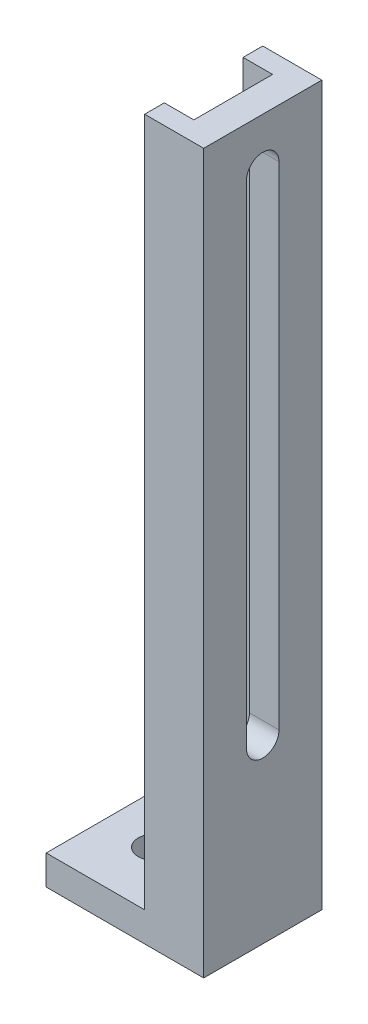
ISO-10303-21;
HEADER;
FILE_DESCRIPTION(('STEP AP214'),'2;1');
FILE_NAME('part.step','',(''),(''),'','','');
FILE_SCHEMA(('AUTOMOTIVE_DESIGN { 1 0 10303 214 1 1 1 1 }'));
ENDSEC;
DATA;
#1=APPLICATION_CONTEXT('core data for automotive mechanical design processes');
#2=APPLICATION_PROTOCOL_DEFINITION('international standard','automotive_design',2000,#1);
#3=PRODUCT_CONTEXT('',#1,'mechanical');
#4=PRODUCT('Part','Part','',(#3));
#5=PRODUCT_RELATED_PRODUCT_CATEGORY('part','',(#4));
#6=PRODUCT_DEFINITION_FORMATION('','',#4);
#7=PRODUCT_DEFINITION_CONTEXT('part definition',#1,'design');
#8=PRODUCT_DEFINITION('design','',#6,#7);
#9=PRODUCT_DEFINITION_SHAPE('','',#8);
#10=(LENGTH_UNIT() NAMED_UNIT(*) SI_UNIT(.MILLI.,.METRE.));
#11=(NAMED_UNIT(*) PLANE_ANGLE_UNIT() SI_UNIT($,.RADIAN.));
#12=(NAMED_UNIT(*) SI_UNIT($,.STERADIAN.) SOLID_ANGLE_UNIT());
#13=UNCERTAINTY_MEASURE_WITH_UNIT(LENGTH_MEASURE(1.E-05),#10,'distance_accuracy_value','');
#14=(GEOMETRIC_REPRESENTATION_CONTEXT(3) GLOBAL_UNCERTAINTY_ASSIGNED_CONTEXT((#13)) GLOBAL_UNIT_ASSIGNED_CONTEXT((#10,
#11,#12)) REPRESENTATION_CONTEXT('',''));
#15=CARTESIAN_POINT('',(0.,0.,0.));
#16=DIRECTION('',(0.,0.,1.));
#17=DIRECTION('',(1.,0.,0.));
#18=AXIS2_PLACEMENT_3D('',#15,#16,#17);
#19=CARTESIAN_POINT('',(-3.,70.,6.));
#20=DIRECTION('',(1.,0.,0.));
#21=DIRECTION('',(0.,0.,-1.));
#22=AXIS2_PLACEMENT_3D('',#19,#20,#21);
#23=PLANE('',#22);
#24=DIRECTION('',(0.,1.,0.));
#25=VECTOR('',#24,1.);
#26=CARTESIAN_POINT('',(-3.,70.,-4.));
#27=LINE('',#26,#25);
#28=CARTESIAN_POINT('',(-3.,10.,-4.00000000000001));
#29=VERTEX_POINT('',#28);
#30=CARTESIAN_POINT('',(-3.,70.,-4.));
#31=VERTEX_POINT('',#30);
#32=EDGE_CURVE('E178',#29,#31,#27,.T.);
#33=ORIENTED_EDGE('',*,*,#32,.T.);
#34=DIRECTION('',(0.,0.,1.));
#35=VECTOR('',#34,1.);
#36=CARTESIAN_POINT('',(-3.,70.,6.));
#37=LINE('',#36,#35);
#38=CARTESIAN_POINT('',(-3.,70.,-6.));
#39=VERTEX_POINT('',#38);
#40=EDGE_CURVE('E260',#39,#31,#37,.T.);
#41=ORIENTED_EDGE('',*,*,#40,.F.);
#42=DIRECTION('',(0.,-1.,0.));
#43=VECTOR('',#42,1.);
#44=CARTESIAN_POINT('',(-3.,70.,-6.));
#45=LINE('',#44,#43);
#46=CARTESIAN_POINT('',(-3.,0.,-6.));
#47=VERTEX_POINT('',#46);
#48=EDGE_CURVE('E274',#39,#47,#45,.T.);
#49=ORIENTED_EDGE('',*,*,#48,.T.);
#50=DIRECTION('',(0.,0.,1.));
#51=VECTOR('',#50,1.);
#52=CARTESIAN_POINT('',(-3.,0.,6.));
#53=LINE('',#52,#51);
#54=CARTESIAN_POINT('',(-3.,0.,6.));
#55=VERTEX_POINT('',#54);
#56=EDGE_CURVE('E256',#47,#55,#53,.T.);
#57=ORIENTED_EDGE('',*,*,#56,.T.);
#58=DIRECTION('',(0.,-1.,0.));
#59=VECTOR('',#58,1.);
#60=CARTESIAN_POINT('',(-3.,70.,6.));
#61=LINE('',#60,#59);
#62=CARTESIAN_POINT('',(-3.,70.,6.));
#63=VERTEX_POINT('',#62);
#64=EDGE_CURVE('E11',#63,#55,#61,.T.);
#65=ORIENTED_EDGE('',*,*,#64,.F.);
#66=CARTESIAN_POINT('',(-3.,70.,4.));
#67=VERTEX_POINT('',#66);
#68=EDGE_CURVE('E265',#67,#63,#37,.T.);
#69=ORIENTED_EDGE('',*,*,#68,.F.);
#70=DIRECTION('',(0.,-1.,0.));
#71=VECTOR('',#70,1.);
#72=CARTESIAN_POINT('',(-3.,70.,4.));
#73=LINE('',#72,#71);
#74=CARTESIAN_POINT('',(-3.,10.,3.99999999999999));
#75=VERTEX_POINT('',#74);
#76=EDGE_CURVE('E199',#67,#75,#73,.T.);
#77=ORIENTED_EDGE('',*,*,#76,.T.);
#78=DIRECTION('',(0.,0.,-1.));
#79=VECTOR('',#78,1.);
#80=CARTESIAN_POINT('',(-3.,10.,-4.00000000000001));
#81=LINE('',#80,#79);
#82=EDGE_CURVE('E185',#75,#29,#81,.T.);
#83=ORIENTED_EDGE('',*,*,#82,.T.);
#84=EDGE_LOOP('',(#33,#41,#49,#57,#65,#69,#77,#83));
#85=FACE_BOUND('',#84,.T.);
#86=ADVANCED_FACE('F39',(#85),#23,.F.);
#87=CARTESIAN_POINT('',(0.,70.,0.));
#88=DIRECTION('',(0.,1.,0.));
#89=DIRECTION('',(0.,0.,1.));
#90=AXIS2_PLACEMENT_3D('',#87,#88,#89);
#91=PLANE('',#90);
#92=ORIENTED_EDGE('',*,*,#40,.T.);
#93=DIRECTION('',(-1.,0.,0.));
#94=VECTOR('',#93,1.);
#95=CARTESIAN_POINT('',(0.,70.,-4.));
#96=LINE('',#95,#94);
#97=CARTESIAN_POINT('',(0.,70.,-4.));
#98=VERTEX_POINT('',#97);
#99=EDGE_CURVE('E215',#98,#31,#96,.T.);
#100=ORIENTED_EDGE('',*,*,#99,.F.);
#101=DIRECTION('',(0.,0.,1.));
#102=VECTOR('',#101,1.);
#103=CARTESIAN_POINT('',(0.,70.,-4.));
#104=LINE('',#103,#102);
#105=CARTESIAN_POINT('',(0.,70.,4.));
#106=VERTEX_POINT('',#105);
#107=EDGE_CURVE('E184',#98,#106,#104,.T.);
#108=ORIENTED_EDGE('',*,*,#107,.T.);
#109=DIRECTION('',(-1.,0.,0.));
#110=VECTOR('',#109,1.);
#111=CARTESIAN_POINT('',(0.,70.,4.));
#112=LINE('',#111,#110);
#113=EDGE_CURVE('E211',#106,#67,#112,.T.);
#114=ORIENTED_EDGE('',*,*,#113,.T.);
#115=ORIENTED_EDGE('',*,*,#68,.T.);
#116=DIRECTION('',(1.,0.,0.));
#117=VECTOR('',#116,1.);
#118=CARTESIAN_POINT('',(3.,70.,6.));
#119=LINE('',#118,#117);
#120=CARTESIAN_POINT('',(3.,70.,6.));
#121=VERTEX_POINT('',#120);
#122=EDGE_CURVE('E264',#63,#121,#119,.T.);
#123=ORIENTED_EDGE('',*,*,#122,.T.);
#124=DIRECTION('',(0.,0.,-1.));
#125=VECTOR('',#124,1.);
#126=CARTESIAN_POINT('',(3.,70.,6.));
#127=LINE('',#126,#125);
#128=CARTESIAN_POINT('',(3.,70.,-6.));
#129=VERTEX_POINT('',#128);
#130=EDGE_CURVE('E268',#121,#129,#127,.T.);
#131=ORIENTED_EDGE('',*,*,#130,.T.);
#132=DIRECTION('',(-1.,0.,0.));
#133=VECTOR('',#132,1.);
#134=CARTESIAN_POINT('',(3.,70.,-6.));
#135=LINE('',#134,#133);
#136=EDGE_CURVE('E271',#129,#39,#135,.T.);
#137=ORIENTED_EDGE('',*,*,#136,.T.);
#138=EDGE_LOOP('',(#92,#100,#108,#114,#115,#123,#131,#137));
#139=FACE_BOUND('',#138,.T.);
#140=ADVANCED_FACE('F309',(#139),#91,.T.);
#141=CARTESIAN_POINT('',(3.,70.,6.));
#142=DIRECTION('',(0.,0.,-1.));
#143=DIRECTION('',(-1.,0.,0.));
#144=AXIS2_PLACEMENT_3D('',#141,#142,#143);
#145=PLANE('',#144);
#146=ORIENTED_EDGE('',*,*,#64,.T.);
#147=DIRECTION('',(1.,0.,0.));
#148=VECTOR('',#147,1.);
#149=CARTESIAN_POINT('',(3.,0.,6.));
#150=LINE('',#149,#148);
#151=CARTESIAN_POINT('',(-13.,0.,6.));
#152=VERTEX_POINT('',#151);
#153=EDGE_CURVE('E232',#152,#55,#150,.T.);
#154=ORIENTED_EDGE('',*,*,#153,.F.);
#155=DIRECTION('',(0.,1.,0.));
#156=VECTOR('',#155,1.);
#157=CARTESIAN_POINT('',(-13.,-3.,6.));
#158=LINE('',#157,#156);
#159=CARTESIAN_POINT('',(-13.,-3.,6.));
#160=VERTEX_POINT('',#159);
#161=EDGE_CURVE('E253',#160,#152,#158,.T.);
#162=ORIENTED_EDGE('',*,*,#161,.F.);
#163=DIRECTION('',(1.,0.,0.));
#164=VECTOR('',#163,1.);
#165=CARTESIAN_POINT('',(3.,-3.,6.));
#166=LINE('',#165,#164);
#167=CARTESIAN_POINT('',(3.,-3.,6.));
#168=VERTEX_POINT('',#167);
#169=EDGE_CURVE('E240',#160,#168,#166,.T.);
#170=ORIENTED_EDGE('',*,*,#169,.T.);
#171=DIRECTION('',(0.,-1.,0.));
#172=VECTOR('',#171,1.);
#173=CARTESIAN_POINT('',(3.,70.,6.));
#174=LINE('',#173,#172);
#175=EDGE_CURVE('E47',#121,#168,#174,.T.);
#176=ORIENTED_EDGE('',*,*,#175,.F.);
#177=ORIENTED_EDGE('',*,*,#122,.F.);
#178=EDGE_LOOP('',(#146,#154,#162,#170,#176,#177));
#179=FACE_BOUND('',#178,.T.);
#180=ADVANCED_FACE('F297',(#179),#145,.F.);
#181=CARTESIAN_POINT('',(3.,70.,6.));
#182=DIRECTION('',(-1.,0.,0.));
#183=DIRECTION('',(0.,0.,1.));
#184=AXIS2_PLACEMENT_3D('',#181,#182,#183);
#185=PLANE('',#184);
#186=DIRECTION('',(0.,-1.,0.));
#187=VECTOR('',#186,1.);
#188=CARTESIAN_POINT('',(3.,65.,1.65));
#189=LINE('',#188,#187);
#190=CARTESIAN_POINT('',(3.,65.,1.65));
#191=VERTEX_POINT('',#190);
#192=CARTESIAN_POINT('',(3.,15.,1.65000000000001));
#193=VERTEX_POINT('',#192);
#194=EDGE_CURVE('E348',#191,#193,#189,.T.);
#195=ORIENTED_EDGE('',*,*,#194,.F.);
#196=CARTESIAN_POINT('',(3.,65.,0.));
#197=DIRECTION('',(-1.,0.,0.));
#198=DIRECTION('',(0.,0.,1.));
#199=AXIS2_PLACEMENT_3D('',#196,#197,#198);
#200=CIRCLE('',#199,1.65);
#201=CARTESIAN_POINT('',(3.,65.,-1.65));
#202=VERTEX_POINT('',#201);
#203=EDGE_CURVE('E179',#202,#191,#200,.F.);
#204=ORIENTED_EDGE('',*,*,#203,.F.);
#205=DIRECTION('',(0.,1.,0.));
#206=VECTOR('',#205,1.);
#207=CARTESIAN_POINT('',(3.,65.,-1.65));
#208=LINE('',#207,#206);
#209=CARTESIAN_POINT('',(3.,15.,-1.64999999999999));
#210=VERTEX_POINT('',#209);
#211=EDGE_CURVE('E175',#210,#202,#208,.T.);
#212=ORIENTED_EDGE('',*,*,#211,.F.);
#213=CARTESIAN_POINT('',(3.,15.,0.));
#214=DIRECTION('',(-1.,0.,0.));
#215=DIRECTION('',(0.,0.,1.));
#216=AXIS2_PLACEMENT_3D('',#213,#214,#215);
#217=CIRCLE('',#216,1.65);
#218=EDGE_CURVE('E146',#193,#210,#217,.F.);
#219=ORIENTED_EDGE('',*,*,#218,.F.);
#220=EDGE_LOOP('',(#195,#204,#212,#219));
#221=FACE_BOUND('',#220,.T.);
#222=ORIENTED_EDGE('',*,*,#175,.T.);
#223=DIRECTION('',(0.,0.,-1.));
#224=VECTOR('',#223,1.);
#225=CARTESIAN_POINT('',(3.,-3.,-6.));
#226=LINE('',#225,#224);
#227=CARTESIAN_POINT('',(3.,-3.,-6.));
#228=VERTEX_POINT('',#227);
#229=EDGE_CURVE('E227',#168,#228,#226,.T.);
#230=ORIENTED_EDGE('',*,*,#229,.T.);
#231=DIRECTION('',(0.,-1.,0.));
#232=VECTOR('',#231,1.);
#233=CARTESIAN_POINT('',(3.,70.,-6.));
#234=LINE('',#233,#232);
#235=EDGE_CURVE('E281',#129,#228,#234,.T.);
#236=ORIENTED_EDGE('',*,*,#235,.F.);
#237=ORIENTED_EDGE('',*,*,#130,.F.);
#238=EDGE_LOOP('',(#222,#230,#236,#237));
#239=FACE_BOUND('',#238,.T.);
#240=ADVANCED_FACE('F288',(#221,#239),#185,.F.);
#241=CARTESIAN_POINT('',(3.,70.,-6.));
#242=DIRECTION('',(0.,0.,1.));
#243=DIRECTION('',(1.,0.,0.));
#244=AXIS2_PLACEMENT_3D('',#241,#242,#243);
#245=PLANE('',#244);
#246=ORIENTED_EDGE('',*,*,#235,.T.);
#247=DIRECTION('',(-1.,0.,0.));
#248=VECTOR('',#247,1.);
#249=CARTESIAN_POINT('',(3.,-3.,-6.));
#250=LINE('',#249,#248);
#251=CARTESIAN_POINT('',(-13.,-3.,-6.));
#252=VERTEX_POINT('',#251);
#253=EDGE_CURVE('E231',#228,#252,#250,.T.);
#254=ORIENTED_EDGE('',*,*,#253,.T.);
#255=DIRECTION('',(0.,1.,0.));
#256=VECTOR('',#255,1.);
#257=CARTESIAN_POINT('',(-13.,-3.,-6.));
#258=LINE('',#257,#256);
#259=CARTESIAN_POINT('',(-13.,0.,-6.));
#260=VERTEX_POINT('',#259);
#261=EDGE_CURVE('E244',#252,#260,#258,.T.);
#262=ORIENTED_EDGE('',*,*,#261,.T.);
#263=DIRECTION('',(-1.,0.,0.));
#264=VECTOR('',#263,1.);
#265=CARTESIAN_POINT('',(3.,0.,-6.));
#266=LINE('',#265,#264);
#267=EDGE_CURVE('E226',#47,#260,#266,.T.);
#268=ORIENTED_EDGE('',*,*,#267,.F.);
#269=ORIENTED_EDGE('',*,*,#48,.F.);
#270=ORIENTED_EDGE('',*,*,#136,.F.);
#271=EDGE_LOOP('',(#246,#254,#262,#268,#269,#270));
#272=FACE_BOUND('',#271,.T.);
#273=ADVANCED_FACE('F303',(#272),#245,.F.);
#274=CARTESIAN_POINT('',(-13.,-3.,-6.));
#275=DIRECTION('',(-1.,0.,0.));
#276=DIRECTION('',(0.,0.,1.));
#277=AXIS2_PLACEMENT_3D('',#274,#275,#276);
#278=PLANE('',#277);
#279=DIRECTION('',(0.,0.,1.));
#280=VECTOR('',#279,1.);
#281=CARTESIAN_POINT('',(-13.,0.,-6.));
#282=LINE('',#281,#280);
#283=EDGE_CURVE('E247',#260,#152,#282,.T.);
#284=ORIENTED_EDGE('',*,*,#283,.F.);
#285=ORIENTED_EDGE('',*,*,#261,.F.);
#286=DIRECTION('',(0.,0.,1.));
#287=VECTOR('',#286,1.);
#288=CARTESIAN_POINT('',(-13.,-3.,-6.));
#289=LINE('',#288,#287);
#290=EDGE_CURVE('E236',#252,#160,#289,.T.);
#291=ORIENTED_EDGE('',*,*,#290,.T.);
#292=ORIENTED_EDGE('',*,*,#161,.T.);
#293=EDGE_LOOP('',(#284,#285,#291,#292));
#294=FACE_BOUND('',#293,.T.);
#295=ADVANCED_FACE('F301',(#294),#278,.T.);
#296=CARTESIAN_POINT('',(0.,-3.,0.));
#297=DIRECTION('',(0.,-1.,0.));
#298=DIRECTION('',(0.,0.,-1.));
#299=AXIS2_PLACEMENT_3D('',#296,#297,#298);
#300=PLANE('',#299);
#301=CARTESIAN_POINT('',(-8.,-3.,0.));
#302=DIRECTION('',(0.,-1.,0.));
#303=DIRECTION('',(0.,0.,-1.));
#304=AXIS2_PLACEMENT_3D('',#301,#302,#303);
#305=CIRCLE('',#304,1.65);
#306=CARTESIAN_POINT('',(-8.,-3.,-1.65));
#307=VERTEX_POINT('',#306);
#308=EDGE_CURVE('E222',#307,#307,#305,.F.);
#309=ORIENTED_EDGE('',*,*,#308,.T.);
#310=EDGE_LOOP('',(#309));
#311=FACE_BOUND('',#310,.T.);
#312=ORIENTED_EDGE('',*,*,#229,.F.);
#313=ORIENTED_EDGE('',*,*,#169,.F.);
#314=ORIENTED_EDGE('',*,*,#290,.F.);
#315=ORIENTED_EDGE('',*,*,#253,.F.);
#316=EDGE_LOOP('',(#312,#313,#314,#315));
#317=FACE_BOUND('',#316,.T.);
#318=ADVANCED_FACE('F295',(#311,#317),#300,.T.);
#319=CARTESIAN_POINT('',(0.,0.,0.));
#320=DIRECTION('',(0.,-1.,0.));
#321=DIRECTION('',(0.,0.,-1.));
#322=AXIS2_PLACEMENT_3D('',#319,#320,#321);
#323=PLANE('',#322);
#324=CARTESIAN_POINT('',(-8.,0.,0.));
#325=DIRECTION('',(0.,1.,0.));
#326=DIRECTION('',(0.,0.,1.));
#327=AXIS2_PLACEMENT_3D('',#324,#325,#326);
#328=CIRCLE('',#327,1.65);
#329=CARTESIAN_POINT('',(-8.,0.,1.65));
#330=VERTEX_POINT('',#329);
#331=EDGE_CURVE('E218',#330,#330,#328,.T.);
#332=ORIENTED_EDGE('',*,*,#331,.F.);
#333=EDGE_LOOP('',(#332));
#334=FACE_BOUND('',#333,.T.);
#335=ORIENTED_EDGE('',*,*,#56,.F.);
#336=ORIENTED_EDGE('',*,*,#267,.T.);
#337=ORIENTED_EDGE('',*,*,#283,.T.);
#338=ORIENTED_EDGE('',*,*,#153,.T.);
#339=EDGE_LOOP('',(#335,#336,#337,#338));
#340=FACE_BOUND('',#339,.T.);
#341=ADVANCED_FACE('F315',(#334,#340),#323,.F.);
#342=CARTESIAN_POINT('',(-8.,-7.66690475583121,0.));
#343=DIRECTION('',(0.,1.,0.));
#344=DIRECTION('',(0.,0.,1.));
#345=AXIS2_PLACEMENT_3D('',#342,#343,#344);
#346=CYLINDRICAL_SURFACE('',#345,1.65);
#347=ORIENTED_EDGE('',*,*,#331,.T.);
#348=EDGE_LOOP('',(#347));
#349=FACE_BOUND('',#348,.T.);
#350=ORIENTED_EDGE('',*,*,#308,.F.);
#351=EDGE_LOOP('',(#350));
#352=FACE_BOUND('',#351,.T.);
#353=ADVANCED_FACE('F317',(#349,#352),#346,.F.);
#354=CARTESIAN_POINT('',(0.,70.,-4.));
#355=DIRECTION('',(0.,0.,1.));
#356=DIRECTION('',(0.,-1.,0.));
#357=AXIS2_PLACEMENT_3D('',#354,#355,#356);
#358=PLANE('',#357);
#359=ORIENTED_EDGE('',*,*,#32,.F.);
#360=DIRECTION('',(-1.,0.,0.));
#361=VECTOR('',#360,1.);
#362=CARTESIAN_POINT('',(0.,10.,-4.00000000000001));
#363=LINE('',#362,#361);
#364=CARTESIAN_POINT('',(0.,10.,-4.00000000000001));
#365=VERTEX_POINT('',#364);
#366=EDGE_CURVE('E195',#365,#29,#363,.T.);
#367=ORIENTED_EDGE('',*,*,#366,.F.);
#368=DIRECTION('',(0.,1.,0.));
#369=VECTOR('',#368,1.);
#370=CARTESIAN_POINT('',(0.,70.,-4.));
#371=LINE('',#370,#369);
#372=EDGE_CURVE('E180',#365,#98,#371,.T.);
#373=ORIENTED_EDGE('',*,*,#372,.T.);
#374=ORIENTED_EDGE('',*,*,#99,.T.);
#375=EDGE_LOOP('',(#359,#367,#373,#374));
#376=FACE_BOUND('',#375,.T.);
#377=ADVANCED_FACE('F324',(#376),#358,.T.);
#378=CARTESIAN_POINT('',(0.,70.,4.));
#379=DIRECTION('',(0.,0.,-1.));
#380=DIRECTION('',(0.,1.,0.));
#381=AXIS2_PLACEMENT_3D('',#378,#379,#380);
#382=PLANE('',#381);
#383=ORIENTED_EDGE('',*,*,#76,.F.);
#384=ORIENTED_EDGE('',*,*,#113,.F.);
#385=DIRECTION('',(0.,-1.,0.));
#386=VECTOR('',#385,1.);
#387=CARTESIAN_POINT('',(0.,70.,4.));
#388=LINE('',#387,#386);
#389=CARTESIAN_POINT('',(0.,10.,3.99999999999999));
#390=VERTEX_POINT('',#389);
#391=EDGE_CURVE('E189',#106,#390,#388,.T.);
#392=ORIENTED_EDGE('',*,*,#391,.T.);
#393=DIRECTION('',(-1.,0.,0.));
#394=VECTOR('',#393,1.);
#395=CARTESIAN_POINT('',(0.,10.,3.99999999999999));
#396=LINE('',#395,#394);
#397=EDGE_CURVE('E208',#390,#75,#396,.T.);
#398=ORIENTED_EDGE('',*,*,#397,.T.);
#399=EDGE_LOOP('',(#383,#384,#392,#398));
#400=FACE_BOUND('',#399,.T.);
#401=ADVANCED_FACE('F376',(#400),#382,.T.);
#402=CARTESIAN_POINT('',(0.,10.,-4.00000000000001));
#403=DIRECTION('',(0.,1.,0.));
#404=DIRECTION('',(0.,0.,1.));
#405=AXIS2_PLACEMENT_3D('',#402,#403,#404);
#406=PLANE('',#405);
#407=ORIENTED_EDGE('',*,*,#82,.F.);
#408=ORIENTED_EDGE('',*,*,#397,.F.);
#409=DIRECTION('',(0.,0.,-1.));
#410=VECTOR('',#409,1.);
#411=CARTESIAN_POINT('',(0.,10.,-4.00000000000001));
#412=LINE('',#411,#410);
#413=EDGE_CURVE('E192',#390,#365,#412,.T.);
#414=ORIENTED_EDGE('',*,*,#413,.T.);
#415=ORIENTED_EDGE('',*,*,#366,.T.);
#416=EDGE_LOOP('',(#407,#408,#414,#415));
#417=FACE_BOUND('',#416,.T.);
#418=ADVANCED_FACE('F373',(#417),#406,.T.);
#419=CARTESIAN_POINT('',(0.,0.,0.));
#420=DIRECTION('',(-1.,0.,0.));
#421=DIRECTION('',(0.,0.,1.));
#422=AXIS2_PLACEMENT_3D('',#419,#420,#421);
#423=PLANE('',#422);
#424=CARTESIAN_POINT('',(0.,65.,0.));
#425=DIRECTION('',(-1.,0.,0.));
#426=DIRECTION('',(0.,0.,1.));
#427=AXIS2_PLACEMENT_3D('',#424,#425,#426);
#428=CIRCLE('',#427,1.65);
#429=CARTESIAN_POINT('',(0.,65.,1.65));
#430=VERTEX_POINT('',#429);
#431=CARTESIAN_POINT('',(0.,65.,-1.65));
#432=VERTEX_POINT('',#431);
#433=EDGE_CURVE('E62',#430,#432,#428,.T.);
#434=ORIENTED_EDGE('',*,*,#433,.F.);
#435=DIRECTION('',(0.,1.,0.));
#436=VECTOR('',#435,1.);
#437=CARTESIAN_POINT('',(0.,65.,1.65));
#438=LINE('',#437,#436);
#439=CARTESIAN_POINT('',(0.,15.,1.65000000000001));
#440=VERTEX_POINT('',#439);
#441=EDGE_CURVE('E161',#440,#430,#438,.T.);
#442=ORIENTED_EDGE('',*,*,#441,.F.);
#443=CARTESIAN_POINT('',(0.,15.,0.));
#444=DIRECTION('',(-1.,0.,0.));
#445=DIRECTION('',(0.,0.,1.));
#446=AXIS2_PLACEMENT_3D('',#443,#444,#445);
#447=CIRCLE('',#446,1.65);
#448=CARTESIAN_POINT('',(0.,15.,-1.64999999999999));
#449=VERTEX_POINT('',#448);
#450=EDGE_CURVE('E143',#449,#440,#447,.T.);
#451=ORIENTED_EDGE('',*,*,#450,.F.);
#452=DIRECTION('',(0.,-1.,0.));
#453=VECTOR('',#452,1.);
#454=CARTESIAN_POINT('',(0.,65.,-1.65));
#455=LINE('',#454,#453);
#456=EDGE_CURVE('E153',#432,#449,#455,.T.);
#457=ORIENTED_EDGE('',*,*,#456,.F.);
#458=EDGE_LOOP('',(#434,#442,#451,#457));
#459=FACE_BOUND('',#458,.T.);
#460=ORIENTED_EDGE('',*,*,#372,.F.);
#461=ORIENTED_EDGE('',*,*,#413,.F.);
#462=ORIENTED_EDGE('',*,*,#391,.F.);
#463=ORIENTED_EDGE('',*,*,#107,.F.);
#464=EDGE_LOOP('',(#460,#461,#462,#463));
#465=FACE_BOUND('',#464,.T.);
#466=ADVANCED_FACE('F158',(#459,#465),#423,.T.);
#467=CARTESIAN_POINT('',(56.402059885364,65.,0.));
#468=DIRECTION('',(-1.,0.,0.));
#469=DIRECTION('',(0.,0.,1.));
#470=AXIS2_PLACEMENT_3D('',#467,#468,#469);
#471=CYLINDRICAL_SURFACE('',#470,1.65);
#472=ORIENTED_EDGE('',*,*,#203,.T.);
#473=DIRECTION('',(-1.,0.,0.));
#474=VECTOR('',#473,1.);
#475=CARTESIAN_POINT('',(56.402059885364,65.,1.65));
#476=LINE('',#475,#474);
#477=EDGE_CURVE('E168',#191,#430,#476,.T.);
#478=ORIENTED_EDGE('',*,*,#477,.T.);
#479=ORIENTED_EDGE('',*,*,#433,.T.);
#480=DIRECTION('',(-1.,0.,0.));
#481=VECTOR('',#480,1.);
#482=CARTESIAN_POINT('',(56.402059885364,65.,-1.65));
#483=LINE('',#482,#481);
#484=EDGE_CURVE('E150',#202,#432,#483,.T.);
#485=ORIENTED_EDGE('',*,*,#484,.F.);
#486=EDGE_LOOP('',(#472,#478,#479,#485));
#487=FACE_BOUND('',#486,.T.);
#488=ADVANCED_FACE('F358',(#487),#471,.F.);
#489=CARTESIAN_POINT('',(56.402059885364,65.,1.65));
#490=DIRECTION('',(0.,0.,1.));
#491=DIRECTION('',(0.,-1.,0.));
#492=AXIS2_PLACEMENT_3D('',#489,#490,#491);
#493=PLANE('',#492);
#494=ORIENTED_EDGE('',*,*,#194,.T.);
#495=DIRECTION('',(-1.,0.,0.));
#496=VECTOR('',#495,1.);
#497=CARTESIAN_POINT('',(56.402059885364,15.,1.65000000000001));
#498=LINE('',#497,#496);
#499=EDGE_CURVE('E149',#193,#440,#498,.T.);
#500=ORIENTED_EDGE('',*,*,#499,.T.);
#501=ORIENTED_EDGE('',*,*,#441,.T.);
#502=ORIENTED_EDGE('',*,*,#477,.F.);
#503=EDGE_LOOP('',(#494,#500,#501,#502));
#504=FACE_BOUND('',#503,.T.);
#505=ADVANCED_FACE('F359',(#504),#493,.F.);
#506=CARTESIAN_POINT('',(56.402059885364,15.,0.));
#507=DIRECTION('',(-1.,0.,0.));
#508=DIRECTION('',(0.,0.,1.));
#509=AXIS2_PLACEMENT_3D('',#506,#507,#508);
#510=CYLINDRICAL_SURFACE('',#509,1.65);
#511=ORIENTED_EDGE('',*,*,#218,.T.);
#512=DIRECTION('',(-1.,0.,0.));
#513=VECTOR('',#512,1.);
#514=CARTESIAN_POINT('',(56.402059885364,15.,-1.64999999999999));
#515=LINE('',#514,#513);
#516=EDGE_CURVE('E54',#210,#449,#515,.T.);
#517=ORIENTED_EDGE('',*,*,#516,.T.);
#518=ORIENTED_EDGE('',*,*,#450,.T.);
#519=ORIENTED_EDGE('',*,*,#499,.F.);
#520=EDGE_LOOP('',(#511,#517,#518,#519));
#521=FACE_BOUND('',#520,.T.);
#522=ADVANCED_FACE('F140',(#521),#510,.F.);
#523=CARTESIAN_POINT('',(56.402059885364,65.,-1.65));
#524=DIRECTION('',(0.,0.,-1.));
#525=DIRECTION('',(0.,1.,0.));
#526=AXIS2_PLACEMENT_3D('',#523,#524,#525);
#527=PLANE('',#526);
#528=ORIENTED_EDGE('',*,*,#211,.T.);
#529=ORIENTED_EDGE('',*,*,#484,.T.);
#530=ORIENTED_EDGE('',*,*,#456,.T.);
#531=ORIENTED_EDGE('',*,*,#516,.F.);
#532=EDGE_LOOP('',(#528,#529,#530,#531));
#533=FACE_BOUND('',#532,.T.);
#534=ADVANCED_FACE('F154',(#533),#527,.F.);
#535=CLOSED_SHELL('',(#86,#140,#180,#240,#273,#295,#318,#341,#353,#377,#401,#418,#466,#488,#505,
#522,#534));
#536=MANIFOLD_SOLID_BREP('B2',#535);
#537=ADVANCED_BREP_SHAPE_REPRESENTATION('',(#18,#536),#14);
#538=SHAPE_DEFINITION_REPRESENTATION(#9,#537);
ENDSEC;
END-ISO-10303-21;
